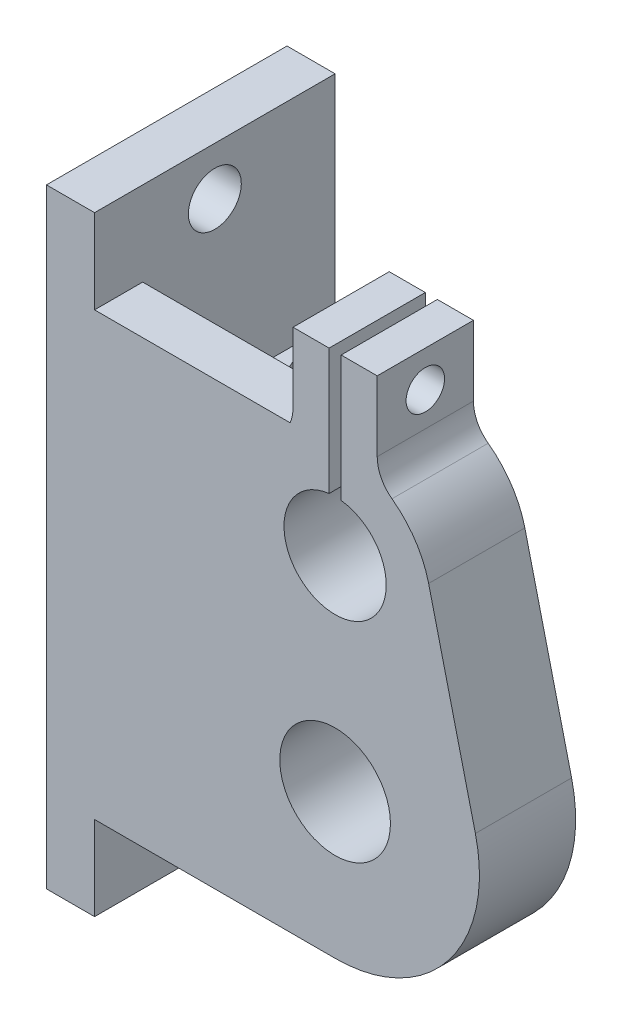
ISO-10303-21;
HEADER;
FILE_DESCRIPTION(('STEP AP214'),'2;1');
FILE_NAME('part.step','',(''),(''),'','','');
FILE_SCHEMA(('AUTOMOTIVE_DESIGN { 1 0 10303 214 1 1 1 1 }'));
ENDSEC;
DATA;
#1=APPLICATION_CONTEXT('core data for automotive mechanical design processes');
#2=APPLICATION_PROTOCOL_DEFINITION('international standard','automotive_design',2000,#1);
#3=PRODUCT_CONTEXT('',#1,'mechanical');
#4=PRODUCT('Part','Part','',(#3));
#5=PRODUCT_RELATED_PRODUCT_CATEGORY('part','',(#4));
#6=PRODUCT_DEFINITION_FORMATION('','',#4);
#7=PRODUCT_DEFINITION_CONTEXT('part definition',#1,'design');
#8=PRODUCT_DEFINITION('design','',#6,#7);
#9=PRODUCT_DEFINITION_SHAPE('','',#8);
#10=(LENGTH_UNIT() NAMED_UNIT(*) SI_UNIT(.MILLI.,.METRE.));
#11=(NAMED_UNIT(*) PLANE_ANGLE_UNIT() SI_UNIT($,.RADIAN.));
#12=(NAMED_UNIT(*) SI_UNIT($,.STERADIAN.) SOLID_ANGLE_UNIT());
#13=UNCERTAINTY_MEASURE_WITH_UNIT(LENGTH_MEASURE(1.E-05),#10,'distance_accuracy_value','');
#14=(GEOMETRIC_REPRESENTATION_CONTEXT(3) GLOBAL_UNCERTAINTY_ASSIGNED_CONTEXT((#13)) GLOBAL_UNIT_ASSIGNED_CONTEXT((#10,
#11,#12)) REPRESENTATION_CONTEXT('',''));
#15=CARTESIAN_POINT('',(0.,0.,0.));
#16=DIRECTION('',(0.,0.,1.));
#17=DIRECTION('',(1.,0.,0.));
#18=AXIS2_PLACEMENT_3D('',#15,#16,#17);
#19=CARTESIAN_POINT('',(27.5,0.,4.));
#20=DIRECTION('',(1.,0.,0.));
#21=DIRECTION('',(0.,1.,0.));
#22=AXIS2_PLACEMENT_3D('',#19,#20,#21);
#23=PLANE('',#22);
#24=DIRECTION('',(0.,0.,-1.));
#25=VECTOR('',#24,1.);
#26=CARTESIAN_POINT('',(27.5,46.8741196746494,4.));
#27=LINE('',#26,#25);
#28=CARTESIAN_POINT('',(27.5,46.8741196746494,4.));
#29=VERTEX_POINT('',#28);
#30=CARTESIAN_POINT('',(27.5,46.8741196746494,-4.));
#31=VERTEX_POINT('',#30);
#32=EDGE_CURVE('E477',#29,#31,#27,.T.);
#33=ORIENTED_EDGE('',*,*,#32,.T.);
#34=DIRECTION('',(0.,-1.,0.));
#35=VECTOR('',#34,1.);
#36=CARTESIAN_POINT('',(27.5,0.,-4.));
#37=LINE('',#36,#35);
#38=CARTESIAN_POINT('',(27.5,52.6937472849691,-4.));
#39=VERTEX_POINT('',#38);
#40=EDGE_CURVE('E307',#39,#31,#37,.T.);
#41=ORIENTED_EDGE('',*,*,#40,.F.);
#42=DIRECTION('',(0.,0.,-1.));
#43=VECTOR('',#42,1.);
#44=CARTESIAN_POINT('',(27.5,52.6937472849691,4.));
#45=LINE('',#44,#43);
#46=CARTESIAN_POINT('',(27.5,52.6937472849691,4.));
#47=VERTEX_POINT('',#46);
#48=EDGE_CURVE('E475',#47,#39,#45,.T.);
#49=ORIENTED_EDGE('',*,*,#48,.F.);
#50=DIRECTION('',(0.,-1.,0.));
#51=VECTOR('',#50,1.);
#52=CARTESIAN_POINT('',(27.5,0.,4.));
#53=LINE('',#52,#51);
#54=EDGE_CURVE('E413',#47,#29,#53,.T.);
#55=ORIENTED_EDGE('',*,*,#54,.T.);
#56=EDGE_LOOP('',(#33,#41,#49,#55));
#57=FACE_BOUND('',#56,.T.);
#58=CARTESIAN_POINT('',(27.5,49.6937472849691,0.));
#59=DIRECTION('',(1.,0.,0.));
#60=DIRECTION('',(0.,1.,0.));
#61=AXIS2_PLACEMENT_3D('',#58,#59,#60);
#62=CIRCLE('',#61,1.6);
#63=CARTESIAN_POINT('',(27.5,51.2937472849691,0.));
#64=VERTEX_POINT('',#63);
#65=EDGE_CURVE('E277',#64,#64,#62,.F.);
#66=ORIENTED_EDGE('',*,*,#65,.T.);
#67=EDGE_LOOP('',(#66));
#68=FACE_BOUND('',#67,.T.);
#69=ADVANCED_FACE('F39',(#57,#68),#23,.T.);
#70=CARTESIAN_POINT('',(24.5,0.,4.));
#71=DIRECTION('',(1.,0.,0.));
#72=DIRECTION('',(0.,0.,-1.));
#73=AXIS2_PLACEMENT_3D('',#70,#71,#72);
#74=PLANE('',#73);
#75=DIRECTION('',(0.,0.,-1.));
#76=VECTOR('',#75,1.);
#77=CARTESIAN_POINT('',(24.5,52.6937472849691,4.));
#78=LINE('',#77,#76);
#79=CARTESIAN_POINT('',(24.5,52.6937472849691,4.));
#80=VERTEX_POINT('',#79);
#81=CARTESIAN_POINT('',(24.5,52.6937472849691,-4.));
#82=VERTEX_POINT('',#81);
#83=EDGE_CURVE('E473',#80,#82,#78,.T.);
#84=ORIENTED_EDGE('',*,*,#83,.T.);
#85=DIRECTION('',(0.,-1.,0.));
#86=VECTOR('',#85,1.);
#87=CARTESIAN_POINT('',(24.5,0.,-4.));
#88=LINE('',#87,#86);
#89=CARTESIAN_POINT('',(24.5,42.2204857540335,-4.));
#90=VERTEX_POINT('',#89);
#91=EDGE_CURVE('E314',#82,#90,#88,.T.);
#92=ORIENTED_EDGE('',*,*,#91,.T.);
#93=DIRECTION('',(0.,0.,-1.));
#94=VECTOR('',#93,1.);
#95=CARTESIAN_POINT('',(24.5,42.2204857540335,4.));
#96=LINE('',#95,#94);
#97=CARTESIAN_POINT('',(24.5,42.2204857540335,4.));
#98=VERTEX_POINT('',#97);
#99=EDGE_CURVE('E471',#98,#90,#96,.T.);
#100=ORIENTED_EDGE('',*,*,#99,.F.);
#101=DIRECTION('',(0.,-1.,0.));
#102=VECTOR('',#101,1.);
#103=CARTESIAN_POINT('',(24.5,0.,4.));
#104=LINE('',#103,#102);
#105=EDGE_CURVE('E418',#80,#98,#104,.T.);
#106=ORIENTED_EDGE('',*,*,#105,.F.);
#107=EDGE_LOOP('',(#84,#92,#100,#106));
#108=FACE_BOUND('',#107,.T.);
#109=CARTESIAN_POINT('',(24.5,49.6937472849689,0.));
#110=DIRECTION('',(1.,0.,0.));
#111=DIRECTION('',(0.,0.,-1.));
#112=AXIS2_PLACEMENT_3D('',#109,#110,#111);
#113=CIRCLE('',#112,1.6);
#114=CARTESIAN_POINT('',(24.5,49.6937472849689,-1.6));
#115=VERTEX_POINT('',#114);
#116=EDGE_CURVE('E274',#115,#115,#113,.F.);
#117=ORIENTED_EDGE('',*,*,#116,.F.);
#118=EDGE_LOOP('',(#117));
#119=FACE_BOUND('',#118,.T.);
#120=ADVANCED_FACE('F533',(#108,#119),#74,.F.);
#121=CARTESIAN_POINT('',(23.5,0.,4.));
#122=DIRECTION('',(1.,0.,0.));
#123=DIRECTION('',(0.,0.,-1.));
#124=AXIS2_PLACEMENT_3D('',#121,#122,#123);
#125=PLANE('',#124);
#126=DIRECTION('',(0.,0.,-1.));
#127=VECTOR('',#126,1.);
#128=CARTESIAN_POINT('',(23.5,42.2204857540335,4.));
#129=LINE('',#128,#127);
#130=CARTESIAN_POINT('',(23.5,42.2204857540335,4.));
#131=VERTEX_POINT('',#130);
#132=CARTESIAN_POINT('',(23.5,42.2204857540335,-4.));
#133=VERTEX_POINT('',#132);
#134=EDGE_CURVE('E469',#131,#133,#129,.T.);
#135=ORIENTED_EDGE('',*,*,#134,.T.);
#136=DIRECTION('',(0.,-1.,0.));
#137=VECTOR('',#136,1.);
#138=CARTESIAN_POINT('',(23.5,0.,-4.));
#139=LINE('',#138,#137);
#140=CARTESIAN_POINT('',(23.5,52.6937472849691,-4.));
#141=VERTEX_POINT('',#140);
#142=EDGE_CURVE('E320',#141,#133,#139,.T.);
#143=ORIENTED_EDGE('',*,*,#142,.F.);
#144=DIRECTION('',(0.,0.,-1.));
#145=VECTOR('',#144,1.);
#146=CARTESIAN_POINT('',(23.5,52.6937472849691,4.));
#147=LINE('',#146,#145);
#148=CARTESIAN_POINT('',(23.5,52.6937472849691,4.));
#149=VERTEX_POINT('',#148);
#150=EDGE_CURVE('E467',#149,#141,#147,.T.);
#151=ORIENTED_EDGE('',*,*,#150,.F.);
#152=DIRECTION('',(0.,-1.,0.));
#153=VECTOR('',#152,1.);
#154=CARTESIAN_POINT('',(23.5,0.,4.));
#155=LINE('',#154,#153);
#156=EDGE_CURVE('E423',#149,#131,#155,.T.);
#157=ORIENTED_EDGE('',*,*,#156,.T.);
#158=EDGE_LOOP('',(#135,#143,#151,#157));
#159=FACE_BOUND('',#158,.T.);
#160=CARTESIAN_POINT('',(23.5,49.6937472849689,0.));
#161=DIRECTION('',(1.,0.,0.));
#162=DIRECTION('',(0.,0.,-1.));
#163=AXIS2_PLACEMENT_3D('',#160,#161,#162);
#164=CIRCLE('',#163,1.6);
#165=CARTESIAN_POINT('',(23.5,49.6937472849689,-1.6));
#166=VERTEX_POINT('',#165);
#167=EDGE_CURVE('E271',#166,#166,#164,.F.);
#168=ORIENTED_EDGE('',*,*,#167,.T.);
#169=EDGE_LOOP('',(#168));
#170=FACE_BOUND('',#169,.T.);
#171=ADVANCED_FACE('F519',(#159,#170),#125,.T.);
#172=CARTESIAN_POINT('',(20.5,0.,4.));
#173=DIRECTION('',(1.,0.,0.));
#174=DIRECTION('',(0.,1.,0.));
#175=AXIS2_PLACEMENT_3D('',#172,#173,#174);
#176=PLANE('',#175);
#177=DIRECTION('',(0.,0.,-1.));
#178=VECTOR('',#177,1.);
#179=CARTESIAN_POINT('',(20.5,52.6937472849691,4.));
#180=LINE('',#179,#178);
#181=CARTESIAN_POINT('',(20.5,52.6937472849691,4.));
#182=VERTEX_POINT('',#181);
#183=CARTESIAN_POINT('',(20.5,52.6937472849691,-4.));
#184=VERTEX_POINT('',#183);
#185=EDGE_CURVE('E465',#182,#184,#180,.T.);
#186=ORIENTED_EDGE('',*,*,#185,.T.);
#187=DIRECTION('',(0.,-1.,0.));
#188=VECTOR('',#187,1.);
#189=CARTESIAN_POINT('',(20.5,0.,-4.));
#190=LINE('',#189,#188);
#191=CARTESIAN_POINT('',(20.5,46.8741196746494,-4.));
#192=VERTEX_POINT('',#191);
#193=EDGE_CURVE('E326',#184,#192,#190,.T.);
#194=ORIENTED_EDGE('',*,*,#193,.T.);
#195=DIRECTION('',(0.,0.,-1.));
#196=VECTOR('',#195,1.);
#197=CARTESIAN_POINT('',(20.5,46.8741196746494,4.));
#198=LINE('',#197,#196);
#199=CARTESIAN_POINT('',(20.5,46.8741196746494,4.));
#200=VERTEX_POINT('',#199);
#201=EDGE_CURVE('E388',#200,#192,#198,.T.);
#202=ORIENTED_EDGE('',*,*,#201,.F.);
#203=DIRECTION('',(0.,-1.,0.));
#204=VECTOR('',#203,1.);
#205=CARTESIAN_POINT('',(20.5,0.,4.));
#206=LINE('',#205,#204);
#207=EDGE_CURVE('E429',#182,#200,#206,.T.);
#208=ORIENTED_EDGE('',*,*,#207,.F.);
#209=EDGE_LOOP('',(#186,#194,#202,#208));
#210=FACE_BOUND('',#209,.T.);
#211=CARTESIAN_POINT('',(20.5,49.6937472849687,0.));
#212=DIRECTION('',(1.,0.,0.));
#213=DIRECTION('',(0.,1.,0.));
#214=AXIS2_PLACEMENT_3D('',#211,#212,#213);
#215=CIRCLE('',#214,1.6);
#216=CARTESIAN_POINT('',(20.5,51.2937472849687,0.));
#217=VERTEX_POINT('',#216);
#218=EDGE_CURVE('E43',#217,#217,#215,.F.);
#219=ORIENTED_EDGE('',*,*,#218,.F.);
#220=EDGE_LOOP('',(#219));
#221=FACE_BOUND('',#220,.T.);
#222=ADVANCED_FACE('F509',(#210,#221),#176,.F.);
#223=CARTESIAN_POINT('',(0.,0.,4.));
#224=DIRECTION('',(1.,0.,0.));
#225=DIRECTION('',(0.,1.,0.));
#226=AXIS2_PLACEMENT_3D('',#223,#224,#225);
#227=PLANE('',#226);
#228=CARTESIAN_POINT('',(0.,5.99999999999979,-6.));
#229=DIRECTION('',(1.,0.,0.));
#230=DIRECTION('',(0.,1.,0.));
#231=AXIS2_PLACEMENT_3D('',#228,#229,#230);
#232=CIRCLE('',#231,2.2);
#233=CARTESIAN_POINT('',(0.,8.19999999999979,-6.));
#234=VERTEX_POINT('',#233);
#235=EDGE_CURVE('E283',#234,#234,#232,.T.);
#236=ORIENTED_EDGE('',*,*,#235,.T.);
#237=EDGE_LOOP('',(#236));
#238=FACE_BOUND('',#237,.T.);
#239=DIRECTION('',(0.,0.,-1.));
#240=VECTOR('',#239,1.);
#241=CARTESIAN_POINT('',(0.,2.,4.));
#242=LINE('',#241,#240);
#243=CARTESIAN_POINT('',(0.,2.,4.));
#244=VERTEX_POINT('',#243);
#245=CARTESIAN_POINT('',(0.,2.,-16.));
#246=VERTEX_POINT('',#245);
#247=EDGE_CURVE('E455',#244,#246,#242,.T.);
#248=ORIENTED_EDGE('',*,*,#247,.F.);
#249=DIRECTION('',(0.,-1.,0.));
#250=VECTOR('',#249,1.);
#251=CARTESIAN_POINT('',(0.,0.,4.));
#252=LINE('',#251,#250);
#253=CARTESIAN_POINT('',(0.,52.6937472849691,4.));
#254=VERTEX_POINT('',#253);
#255=EDGE_CURVE('E443',#254,#244,#252,.T.);
#256=ORIENTED_EDGE('',*,*,#255,.F.);
#257=DIRECTION('',(0.,0.,-1.));
#258=VECTOR('',#257,1.);
#259=CARTESIAN_POINT('',(0.,52.6937472849691,4.));
#260=LINE('',#259,#258);
#261=CARTESIAN_POINT('',(0.,52.6937472849691,-16.));
#262=VERTEX_POINT('',#261);
#263=EDGE_CURVE('E458',#254,#262,#260,.T.);
#264=ORIENTED_EDGE('',*,*,#263,.T.);
#265=DIRECTION('',(0.,-1.,0.));
#266=VECTOR('',#265,1.);
#267=CARTESIAN_POINT('',(0.,0.,-16.));
#268=LINE('',#267,#266);
#269=EDGE_CURVE('E301',#262,#246,#268,.T.);
#270=ORIENTED_EDGE('',*,*,#269,.T.);
#271=EDGE_LOOP('',(#248,#256,#264,#270));
#272=FACE_BOUND('',#271,.T.);
#273=CARTESIAN_POINT('',(0.,48.6937472849689,-5.99999999999999));
#274=DIRECTION('',(1.,0.,0.));
#275=DIRECTION('',(0.,1.,0.));
#276=AXIS2_PLACEMENT_3D('',#273,#274,#275);
#277=CIRCLE('',#276,2.2);
#278=CARTESIAN_POINT('',(0.,50.8937472849689,-5.99999999999999));
#279=VERTEX_POINT('',#278);
#280=EDGE_CURVE('E289',#279,#279,#277,.F.);
#281=ORIENTED_EDGE('',*,*,#280,.F.);
#282=EDGE_LOOP('',(#281));
#283=FACE_BOUND('',#282,.T.);
#284=ADVANCED_FACE('F575',(#238,#272,#283),#227,.F.);
#285=CARTESIAN_POINT('',(4.00000000000043,1.90048411225749E-13,4.));
#286=DIRECTION('',(1.,0.,0.));
#287=DIRECTION('',(0.,1.,0.));
#288=AXIS2_PLACEMENT_3D('',#285,#286,#287);
#289=PLANE('',#288);
#290=DIRECTION('',(0.,0.,-1.));
#291=VECTOR('',#290,1.);
#292=CARTESIAN_POINT('',(3.99999999999901,29.8468736424845,4.));
#293=LINE('',#292,#291);
#294=CARTESIAN_POINT('',(3.99999999999901,29.8468736424845,0.));
#295=VERTEX_POINT('',#294);
#296=CARTESIAN_POINT('',(3.99999999999901,29.8468736424845,-13.9999999999982));
#297=VERTEX_POINT('',#296);
#298=EDGE_CURVE('E234',#295,#297,#293,.T.);
#299=ORIENTED_EDGE('',*,*,#298,.F.);
#300=DIRECTION('',(0.,-1.,0.));
#301=VECTOR('',#300,1.);
#302=CARTESIAN_POINT('',(4.00000000000043,1.90048411225749E-13,0.));
#303=LINE('',#302,#301);
#304=CARTESIAN_POINT('',(3.99999999999941,21.5,0.));
#305=VERTEX_POINT('',#304);
#306=EDGE_CURVE('E48',#295,#305,#303,.T.);
#307=ORIENTED_EDGE('',*,*,#306,.T.);
#308=DIRECTION('',(0.,0.,-1.));
#309=VECTOR('',#308,1.);
#310=CARTESIAN_POINT('',(3.99999999999941,21.5,4.));
#311=LINE('',#310,#309);
#312=CARTESIAN_POINT('',(3.99999999999941,21.5,-13.9999999999973));
#313=VERTEX_POINT('',#312);
#314=EDGE_CURVE('E259',#305,#313,#311,.T.);
#315=ORIENTED_EDGE('',*,*,#314,.T.);
#316=DIRECTION('',(0.,1.,-1.10861573214976E-13));
#317=VECTOR('',#316,1.);
#318=CARTESIAN_POINT('',(4.00000000000043,-1.80545990664326E-12,-13.9999999999949));
#319=LINE('',#318,#317);
#320=CARTESIAN_POINT('',(3.99999999999964,16.5,-13.9999999999968));
#321=VERTEX_POINT('',#320);
#322=EDGE_CURVE('E268',#321,#313,#319,.T.);
#323=ORIENTED_EDGE('',*,*,#322,.F.);
#324=DIRECTION('',(0.,0.,-1.));
#325=VECTOR('',#324,1.);
#326=CARTESIAN_POINT('',(3.99999999999964,16.5,4.));
#327=LINE('',#326,#325);
#328=CARTESIAN_POINT('',(3.99999999999964,16.5,0.));
#329=VERTEX_POINT('',#328);
#330=EDGE_CURVE('E263',#329,#321,#327,.T.);
#331=ORIENTED_EDGE('',*,*,#330,.F.);
#332=CARTESIAN_POINT('',(4.,9.00000000000001,0.));
#333=VERTEX_POINT('',#332);
#334=EDGE_CURVE('E49',#329,#333,#303,.T.);
#335=ORIENTED_EDGE('',*,*,#334,.T.);
#336=DIRECTION('',(0.,0.,-1.));
#337=VECTOR('',#336,1.);
#338=CARTESIAN_POINT('',(4.,9.00000000000001,4.));
#339=LINE('',#338,#337);
#340=CARTESIAN_POINT('',(4.,9.00000000000001,4.));
#341=VERTEX_POINT('',#340);
#342=EDGE_CURVE('E450',#341,#333,#339,.T.);
#343=ORIENTED_EDGE('',*,*,#342,.F.);
#344=DIRECTION('',(0.,-1.,0.));
#345=VECTOR('',#344,1.);
#346=CARTESIAN_POINT('',(4.00000000000043,1.90048411225749E-13,4.));
#347=LINE('',#346,#345);
#348=CARTESIAN_POINT('',(4.,2.,4.));
#349=VERTEX_POINT('',#348);
#350=EDGE_CURVE('E440',#341,#349,#347,.T.);
#351=ORIENTED_EDGE('',*,*,#350,.T.);
#352=DIRECTION('',(0.,0.,-1.));
#353=VECTOR('',#352,1.);
#354=CARTESIAN_POINT('',(4.,2.,4.));
#355=LINE('',#354,#353);
#356=CARTESIAN_POINT('',(4.00000000000033,2.,-16.));
#357=VERTEX_POINT('',#356);
#358=EDGE_CURVE('E453',#349,#357,#355,.T.);
#359=ORIENTED_EDGE('',*,*,#358,.T.);
#360=DIRECTION('',(0.,-1.,0.));
#361=VECTOR('',#360,1.);
#362=CARTESIAN_POINT('',(4.00000000000043,1.90048411225749E-13,-16.));
#363=LINE('',#362,#361);
#364=CARTESIAN_POINT('',(3.99999999999792,52.6937472849691,-16.));
#365=VERTEX_POINT('',#364);
#366=EDGE_CURVE('E295',#365,#357,#363,.T.);
#367=ORIENTED_EDGE('',*,*,#366,.F.);
#368=DIRECTION('',(0.,0.,-1.));
#369=VECTOR('',#368,1.);
#370=CARTESIAN_POINT('',(3.99999999999826,52.6937472849691,4.));
#371=LINE('',#370,#369);
#372=CARTESIAN_POINT('',(3.99999999999826,52.6937472849691,4.));
#373=VERTEX_POINT('',#372);
#374=EDGE_CURVE('E460',#373,#365,#371,.T.);
#375=ORIENTED_EDGE('',*,*,#374,.F.);
#376=CARTESIAN_POINT('',(3.99999999999826,45.6937472849691,4.));
#377=VERTEX_POINT('',#376);
#378=EDGE_CURVE('E436',#373,#377,#347,.T.);
#379=ORIENTED_EDGE('',*,*,#378,.T.);
#380=DIRECTION('',(0.,0.,-1.));
#381=VECTOR('',#380,1.);
#382=CARTESIAN_POINT('',(3.99999999999826,45.6937472849691,4.));
#383=LINE('',#382,#381);
#384=CARTESIAN_POINT('',(3.99999999999826,45.6937472849691,0.));
#385=VERTEX_POINT('',#384);
#386=EDGE_CURVE('E389',#377,#385,#383,.T.);
#387=ORIENTED_EDGE('',*,*,#386,.T.);
#388=CARTESIAN_POINT('',(3.99999999999877,34.8468736424845,0.));
#389=VERTEX_POINT('',#388);
#390=EDGE_CURVE('E11',#385,#389,#303,.T.);
#391=ORIENTED_EDGE('',*,*,#390,.T.);
#392=DIRECTION('',(0.,0.,-1.));
#393=VECTOR('',#392,1.);
#394=CARTESIAN_POINT('',(3.99999999999877,34.8468736424845,4.));
#395=LINE('',#394,#393);
#396=CARTESIAN_POINT('',(3.99999999999877,34.8468736424845,-13.9999999999988));
#397=VERTEX_POINT('',#396);
#398=EDGE_CURVE('E60',#389,#397,#395,.T.);
#399=ORIENTED_EDGE('',*,*,#398,.T.);
#400=DIRECTION('',(0.,1.,-1.10861573214976E-13));
#401=VECTOR('',#400,1.);
#402=CARTESIAN_POINT('',(4.00000000000043,-1.80545990664326E-12,-13.9999999999949));
#403=LINE('',#402,#401);
#404=EDGE_CURVE('E56',#297,#397,#403,.T.);
#405=ORIENTED_EDGE('',*,*,#404,.F.);
#406=EDGE_LOOP('',(#299,#307,#315,#323,#331,#335,#343,#351,#359,#367,#375,#379,#387,#391,#399,#405));
#407=FACE_BOUND('',#406,.T.);
#408=CARTESIAN_POINT('',(3.99999999999795,48.6937472849691,-5.99999999999999));
#409=DIRECTION('',(1.,0.,0.));
#410=DIRECTION('',(0.,1.,0.));
#411=AXIS2_PLACEMENT_3D('',#408,#409,#410);
#412=CIRCLE('',#411,2.2);
#413=CARTESIAN_POINT('',(3.99999999999783,50.8937472849691,-5.99999999999999));
#414=VERTEX_POINT('',#413);
#415=EDGE_CURVE('E286',#414,#414,#412,.F.);
#416=ORIENTED_EDGE('',*,*,#415,.T.);
#417=EDGE_LOOP('',(#416));
#418=FACE_BOUND('',#417,.T.);
#419=CARTESIAN_POINT('',(4.00000000000012,5.99999999999999,-6.));
#420=DIRECTION('',(1.,0.,0.));
#421=DIRECTION('',(0.,1.,0.));
#422=AXIS2_PLACEMENT_3D('',#419,#420,#421);
#423=CIRCLE('',#422,2.2);
#424=CARTESIAN_POINT('',(4.00000000000001,8.19999999999999,-6.));
#425=VERTEX_POINT('',#424);
#426=EDGE_CURVE('E280',#425,#425,#423,.T.);
#427=ORIENTED_EDGE('',*,*,#426,.F.);
#428=EDGE_LOOP('',(#427));
#429=FACE_BOUND('',#428,.T.);
#430=ADVANCED_FACE('F589',(#407,#418,#429),#289,.T.);
#431=CARTESIAN_POINT('',(0.,0.,0.));
#432=DIRECTION('',(0.,0.,1.));
#433=DIRECTION('',(1.,0.,0.));
#434=AXIS2_PLACEMENT_3D('',#431,#432,#433);
#435=PLANE('',#434);
#436=ORIENTED_EDGE('',*,*,#306,.F.);
#437=DIRECTION('',(1.,0.,0.));
#438=VECTOR('',#437,1.);
#439=CARTESIAN_POINT('',(0.,29.8468736424845,0.));
#440=LINE('',#439,#438);
#441=CARTESIAN_POINT('',(10.,29.8468736424845,0.));
#442=VERTEX_POINT('',#441);
#443=EDGE_CURVE('E229',#295,#442,#440,.T.);
#444=ORIENTED_EDGE('',*,*,#443,.T.);
#445=DIRECTION('',(0.,1.,0.));
#446=VECTOR('',#445,1.);
#447=CARTESIAN_POINT('',(10.,0.,0.));
#448=LINE('',#447,#446);
#449=CARTESIAN_POINT('',(10.,34.8468736424845,0.));
#450=VERTEX_POINT('',#449);
#451=EDGE_CURVE('E223',#442,#450,#448,.T.);
#452=ORIENTED_EDGE('',*,*,#451,.T.);
#453=DIRECTION('',(1.,0.,0.));
#454=VECTOR('',#453,1.);
#455=CARTESIAN_POINT('',(0.,34.8468736424845,0.));
#456=LINE('',#455,#454);
#457=EDGE_CURVE('E227',#389,#450,#456,.T.);
#458=ORIENTED_EDGE('',*,*,#457,.F.);
#459=ORIENTED_EDGE('',*,*,#390,.F.);
#460=DIRECTION('',(1.,0.,0.));
#461=VECTOR('',#460,1.);
#462=CARTESIAN_POINT('',(0.,45.6937472849691,0.));
#463=LINE('',#462,#461);
#464=CARTESIAN_POINT('',(20.2580284664376,45.6937472849691,0.));
#465=VERTEX_POINT('',#464);
#466=EDGE_CURVE('E380',#385,#465,#463,.T.);
#467=ORIENTED_EDGE('',*,*,#466,.T.);
#468=CARTESIAN_POINT('',(17.5,46.8741196746494,0.));
#469=DIRECTION('',(0.,0.,1.));
#470=DIRECTION('',(1.,0.,0.));
#471=AXIS2_PLACEMENT_3D('',#468,#469,#470);
#472=CIRCLE('',#471,3.);
#473=CARTESIAN_POINT('',(19.2727272727273,44.4539052179268,0.));
#474=VERTEX_POINT('',#473);
#475=EDGE_CURVE('E374',#465,#474,#472,.F.);
#476=ORIENTED_EDGE('',*,*,#475,.T.);
#477=CARTESIAN_POINT('',(24.,38.,0.));
#478=DIRECTION('',(0.,0.,1.));
#479=DIRECTION('',(1.,0.,0.));
#480=AXIS2_PLACEMENT_3D('',#477,#478,#479);
#481=CIRCLE('',#480,8.);
#482=CARTESIAN_POINT('',(16.2246062861844,39.8823529411765,0.));
#483=VERTEX_POINT('',#482);
#484=EDGE_CURVE('E303',#474,#483,#481,.T.);
#485=ORIENTED_EDGE('',*,*,#484,.T.);
#486=DIRECTION('',(-0.23529411764706,-0.971924214226959,0.));
#487=VECTOR('',#486,1.);
#488=CARTESIAN_POINT('',(6.20574064755985,-1.50235404020207,0.));
#489=LINE('',#488,#487);
#490=CARTESIAN_POINT('',(12.3369094292765,23.8235294117647,0.));
#491=VERTEX_POINT('',#490);
#492=EDGE_CURVE('E353',#483,#491,#489,.T.);
#493=ORIENTED_EDGE('',*,*,#492,.T.);
#494=CARTESIAN_POINT('',(24.,21.,0.));
#495=DIRECTION('',(0.,0.,1.));
#496=DIRECTION('',(1.,0.,0.));
#497=AXIS2_PLACEMENT_3D('',#494,#495,#496);
#498=CIRCLE('',#497,12.);
#499=CARTESIAN_POINT('',(24.,9.00000000000001,0.));
#500=VERTEX_POINT('',#499);
#501=EDGE_CURVE('E308',#491,#500,#498,.T.);
#502=ORIENTED_EDGE('',*,*,#501,.T.);
#503=DIRECTION('',(1.,0.,0.));
#504=VECTOR('',#503,1.);
#505=CARTESIAN_POINT('',(0.,9.00000000000001,0.));
#506=LINE('',#505,#504);
#507=EDGE_CURVE('E358',#333,#500,#506,.T.);
#508=ORIENTED_EDGE('',*,*,#507,.F.);
#509=ORIENTED_EDGE('',*,*,#334,.F.);
#510=DIRECTION('',(1.,0.,0.));
#511=VECTOR('',#510,1.);
#512=CARTESIAN_POINT('',(0.,16.5,0.));
#513=LINE('',#512,#511);
#514=CARTESIAN_POINT('',(10.,16.5,0.));
#515=VERTEX_POINT('',#514);
#516=EDGE_CURVE('E261',#329,#515,#513,.T.);
#517=ORIENTED_EDGE('',*,*,#516,.T.);
#518=DIRECTION('',(0.,1.,0.));
#519=VECTOR('',#518,1.);
#520=CARTESIAN_POINT('',(10.,0.,0.));
#521=LINE('',#520,#519);
#522=CARTESIAN_POINT('',(10.,21.5,0.));
#523=VERTEX_POINT('',#522);
#524=EDGE_CURVE('E266',#515,#523,#521,.T.);
#525=ORIENTED_EDGE('',*,*,#524,.T.);
#526=DIRECTION('',(1.,0.,0.));
#527=VECTOR('',#526,1.);
#528=CARTESIAN_POINT('',(0.,21.5,0.));
#529=LINE('',#528,#527);
#530=EDGE_CURVE('E254',#305,#523,#529,.T.);
#531=ORIENTED_EDGE('',*,*,#530,.F.);
#532=EDGE_LOOP('',(#436,#444,#452,#458,#459,#467,#476,#485,#493,#502,#508,#509,#517,#525,#531));
#533=FACE_BOUND('',#532,.T.);
#534=ADVANCED_FACE('F226',(#533),#435,.F.);
#535=CARTESIAN_POINT('',(0.,9.00000000000001,4.));
#536=DIRECTION('',(0.,1.,0.));
#537=DIRECTION('',(0.,0.,1.));
#538=AXIS2_PLACEMENT_3D('',#535,#536,#537);
#539=PLANE('',#538);
#540=ORIENTED_EDGE('',*,*,#507,.T.);
#541=DIRECTION('',(0.,0.,-1.));
#542=VECTOR('',#541,1.);
#543=CARTESIAN_POINT('',(24.,9.00000000000001,4.));
#544=LINE('',#543,#542);
#545=CARTESIAN_POINT('',(24.,9.00000000000001,4.));
#546=VERTEX_POINT('',#545);
#547=EDGE_CURVE('E371',#546,#500,#544,.T.);
#548=ORIENTED_EDGE('',*,*,#547,.F.);
#549=DIRECTION('',(1.,0.,0.));
#550=VECTOR('',#549,1.);
#551=CARTESIAN_POINT('',(0.,9.00000000000001,4.));
#552=LINE('',#551,#550);
#553=EDGE_CURVE('E364',#341,#546,#552,.T.);
#554=ORIENTED_EDGE('',*,*,#553,.F.);
#555=ORIENTED_EDGE('',*,*,#342,.T.);
#556=EDGE_LOOP('',(#540,#548,#554,#555));
#557=FACE_BOUND('',#556,.T.);
#558=ADVANCED_FACE('F41',(#557),#539,.F.);
#559=CARTESIAN_POINT('',(24.,21.,4.));
#560=DIRECTION('',(0.,0.,-1.));
#561=DIRECTION('',(-1.,0.,0.));
#562=AXIS2_PLACEMENT_3D('',#559,#560,#561);
#563=CYLINDRICAL_SURFACE('',#562,12.);
#564=ORIENTED_EDGE('',*,*,#547,.T.);
#565=ORIENTED_EDGE('',*,*,#501,.F.);
#566=DIRECTION('',(0.,0.,1.));
#567=VECTOR('',#566,1.);
#568=CARTESIAN_POINT('',(12.3369094292765,23.8235294117647,-4.));
#569=LINE('',#568,#567);
#570=CARTESIAN_POINT('',(12.3369094292765,23.8235294117647,-4.));
#571=VERTEX_POINT('',#570);
#572=EDGE_CURVE('E356',#571,#491,#569,.T.);
#573=ORIENTED_EDGE('',*,*,#572,.F.);
#574=CARTESIAN_POINT('',(24.,21.,-4.));
#575=DIRECTION('',(0.,0.,1.));
#576=DIRECTION('',(1.,0.,0.));
#577=AXIS2_PLACEMENT_3D('',#574,#575,#576);
#578=CIRCLE('',#577,12.);
#579=CARTESIAN_POINT('',(35.6630905707235,23.8235294117647,-4.));
#580=VERTEX_POINT('',#579);
#581=EDGE_CURVE('E338',#571,#580,#578,.T.);
#582=ORIENTED_EDGE('',*,*,#581,.T.);
#583=DIRECTION('',(0.,0.,-1.));
#584=VECTOR('',#583,1.);
#585=CARTESIAN_POINT('',(35.6630905707235,23.8235294117647,4.));
#586=LINE('',#585,#584);
#587=CARTESIAN_POINT('',(35.6630905707235,23.8235294117647,4.));
#588=VERTEX_POINT('',#587);
#589=EDGE_CURVE('E375',#588,#580,#586,.T.);
#590=ORIENTED_EDGE('',*,*,#589,.F.);
#591=CARTESIAN_POINT('',(24.,21.,4.));
#592=DIRECTION('',(0.,0.,1.));
#593=DIRECTION('',(1.,0.,0.));
#594=AXIS2_PLACEMENT_3D('',#591,#592,#593);
#595=CIRCLE('',#594,12.);
#596=EDGE_CURVE('E397',#546,#588,#595,.T.);
#597=ORIENTED_EDGE('',*,*,#596,.F.);
#598=EDGE_LOOP('',(#564,#565,#573,#582,#590,#597));
#599=FACE_BOUND('',#598,.T.);
#600=ADVANCED_FACE('F492',(#599),#563,.T.);
#601=CARTESIAN_POINT('',(39.1368199060733,9.47467237930237,4.));
#602=DIRECTION('',(0.97192421422696,0.235294117647058,0.));
#603=DIRECTION('',(-0.235294117647058,0.97192421422696,0.));
#604=AXIS2_PLACEMENT_3D('',#601,#602,#603);
#605=PLANE('',#604);
#606=ORIENTED_EDGE('',*,*,#589,.T.);
#607=DIRECTION('',(0.235294117647058,-0.97192421422696,0.));
#608=VECTOR('',#607,1.);
#609=CARTESIAN_POINT('',(39.1368199060733,9.47467237930237,-4.));
#610=LINE('',#609,#608);
#611=CARTESIAN_POINT('',(31.7753937138157,39.8823529411765,-4.));
#612=VERTEX_POINT('',#611);
#613=EDGE_CURVE('E341',#612,#580,#610,.T.);
#614=ORIENTED_EDGE('',*,*,#613,.F.);
#615=DIRECTION('',(0.,0.,-1.));
#616=VECTOR('',#615,1.);
#617=CARTESIAN_POINT('',(31.7753937138157,39.8823529411765,4.));
#618=LINE('',#617,#616);
#619=CARTESIAN_POINT('',(31.7753937138157,39.8823529411765,4.));
#620=VERTEX_POINT('',#619);
#621=EDGE_CURVE('E481',#620,#612,#618,.T.);
#622=ORIENTED_EDGE('',*,*,#621,.F.);
#623=DIRECTION('',(0.235294117647058,-0.97192421422696,0.));
#624=VECTOR('',#623,1.);
#625=CARTESIAN_POINT('',(39.1368199060733,9.47467237930237,4.));
#626=LINE('',#625,#624);
#627=EDGE_CURVE('E402',#620,#588,#626,.T.);
#628=ORIENTED_EDGE('',*,*,#627,.T.);
#629=EDGE_LOOP('',(#606,#614,#622,#628));
#630=FACE_BOUND('',#629,.T.);
#631=ADVANCED_FACE('F484',(#630),#605,.T.);
#632=CARTESIAN_POINT('',(24.,38.,4.));
#633=DIRECTION('',(0.,0.,-1.));
#634=DIRECTION('',(-1.,0.,0.));
#635=AXIS2_PLACEMENT_3D('',#632,#633,#634);
#636=CYLINDRICAL_SURFACE('',#635,7.99999999999999);
#637=ORIENTED_EDGE('',*,*,#621,.T.);
#638=CARTESIAN_POINT('',(24.,38.,-4.));
#639=DIRECTION('',(0.,0.,1.));
#640=DIRECTION('',(1.,0.,0.));
#641=AXIS2_PLACEMENT_3D('',#638,#639,#640);
#642=CIRCLE('',#641,7.99999999999999);
#643=CARTESIAN_POINT('',(28.7272727272727,44.4539052179269,-4.));
#644=VERTEX_POINT('',#643);
#645=EDGE_CURVE('E344',#612,#644,#642,.T.);
#646=ORIENTED_EDGE('',*,*,#645,.T.);
#647=DIRECTION('',(0.,0.,-1.));
#648=VECTOR('',#647,1.);
#649=CARTESIAN_POINT('',(28.7272727272727,44.4539052179269,4.));
#650=LINE('',#649,#648);
#651=CARTESIAN_POINT('',(28.7272727272727,44.4539052179269,4.));
#652=VERTEX_POINT('',#651);
#653=EDGE_CURVE('E479',#652,#644,#650,.T.);
#654=ORIENTED_EDGE('',*,*,#653,.F.);
#655=CARTESIAN_POINT('',(24.,38.,4.));
#656=DIRECTION('',(0.,0.,1.));
#657=DIRECTION('',(1.,0.,0.));
#658=AXIS2_PLACEMENT_3D('',#655,#656,#657);
#659=CIRCLE('',#658,7.99999999999999);
#660=EDGE_CURVE('E406',#620,#652,#659,.T.);
#661=ORIENTED_EDGE('',*,*,#660,.F.);
#662=EDGE_LOOP('',(#637,#646,#654,#661));
#663=FACE_BOUND('',#662,.T.);
#664=ADVANCED_FACE('F549',(#663),#636,.T.);
#665=CARTESIAN_POINT('',(30.5,46.8741196746494,4.));
#666=DIRECTION('',(0.,0.,-1.));
#667=DIRECTION('',(-1.,0.,0.));
#668=AXIS2_PLACEMENT_3D('',#665,#666,#667);
#669=CYLINDRICAL_SURFACE('',#668,3.);
#670=ORIENTED_EDGE('',*,*,#653,.T.);
#671=CARTESIAN_POINT('',(30.5,46.8741196746494,-4.));
#672=DIRECTION('',(0.,0.,1.));
#673=DIRECTION('',(1.,0.,0.));
#674=AXIS2_PLACEMENT_3D('',#671,#672,#673);
#675=CIRCLE('',#674,3.);
#676=EDGE_CURVE('E304',#31,#644,#675,.T.);
#677=ORIENTED_EDGE('',*,*,#676,.F.);
#678=ORIENTED_EDGE('',*,*,#32,.F.);
#679=CARTESIAN_POINT('',(30.5,46.8741196746494,4.));
#680=DIRECTION('',(0.,0.,1.));
#681=DIRECTION('',(1.,0.,0.));
#682=AXIS2_PLACEMENT_3D('',#679,#680,#681);
#683=CIRCLE('',#682,3.);
#684=EDGE_CURVE('E410',#29,#652,#683,.T.);
#685=ORIENTED_EDGE('',*,*,#684,.T.);
#686=EDGE_LOOP('',(#670,#677,#678,#685));
#687=FACE_BOUND('',#686,.T.);
#688=ADVANCED_FACE('F544',(#687),#669,.F.);
#689=CARTESIAN_POINT('',(0.,52.6937472849691,4.));
#690=DIRECTION('',(0.,-1.,0.));
#691=DIRECTION('',(0.,0.,-1.));
#692=AXIS2_PLACEMENT_3D('',#689,#690,#691);
#693=PLANE('',#692);
#694=ORIENTED_EDGE('',*,*,#48,.T.);
#695=DIRECTION('',(-1.,0.,0.));
#696=VECTOR('',#695,1.);
#697=CARTESIAN_POINT('',(0.,52.6937472849691,-4.));
#698=LINE('',#697,#696);
#699=EDGE_CURVE('E311',#39,#82,#698,.T.);
#700=ORIENTED_EDGE('',*,*,#699,.T.);
#701=ORIENTED_EDGE('',*,*,#83,.F.);
#702=DIRECTION('',(-1.,0.,0.));
#703=VECTOR('',#702,1.);
#704=CARTESIAN_POINT('',(0.,52.6937472849691,4.));
#705=LINE('',#704,#703);
#706=EDGE_CURVE('E416',#47,#80,#705,.T.);
#707=ORIENTED_EDGE('',*,*,#706,.F.);
#708=EDGE_LOOP('',(#694,#700,#701,#707));
#709=FACE_BOUND('',#708,.T.);
#710=ADVANCED_FACE('F538',(#709),#693,.F.);
#711=CARTESIAN_POINT('',(24.,38.,4.));
#712=DIRECTION('',(0.,0.,-1.));
#713=DIRECTION('',(-1.,0.,0.));
#714=AXIS2_PLACEMENT_3D('',#711,#712,#713);
#715=CYLINDRICAL_SURFACE('',#714,4.25);
#716=ORIENTED_EDGE('',*,*,#99,.T.);
#717=CARTESIAN_POINT('',(24.,38.,-4.));
#718=DIRECTION('',(0.,0.,1.));
#719=DIRECTION('',(1.,0.,0.));
#720=AXIS2_PLACEMENT_3D('',#717,#718,#719);
#721=CIRCLE('',#720,4.25);
#722=EDGE_CURVE('E317',#133,#90,#721,.T.);
#723=ORIENTED_EDGE('',*,*,#722,.F.);
#724=ORIENTED_EDGE('',*,*,#134,.F.);
#725=CARTESIAN_POINT('',(24.,38.,4.));
#726=DIRECTION('',(0.,0.,1.));
#727=DIRECTION('',(1.,0.,0.));
#728=AXIS2_PLACEMENT_3D('',#725,#726,#727);
#729=CIRCLE('',#728,4.25);
#730=EDGE_CURVE('E420',#131,#98,#729,.T.);
#731=ORIENTED_EDGE('',*,*,#730,.T.);
#732=EDGE_LOOP('',(#716,#723,#724,#731));
#733=FACE_BOUND('',#732,.T.);
#734=ADVANCED_FACE('F524',(#733),#715,.F.);
#735=CARTESIAN_POINT('',(0.,52.6937472849691,4.));
#736=DIRECTION('',(0.,1.,0.));
#737=DIRECTION('',(0.,0.,1.));
#738=AXIS2_PLACEMENT_3D('',#735,#736,#737);
#739=PLANE('',#738);
#740=ORIENTED_EDGE('',*,*,#150,.T.);
#741=DIRECTION('',(1.,0.,0.));
#742=VECTOR('',#741,1.);
#743=CARTESIAN_POINT('',(0.,52.6937472849691,-4.));
#744=LINE('',#743,#742);
#745=EDGE_CURVE('E323',#184,#141,#744,.T.);
#746=ORIENTED_EDGE('',*,*,#745,.F.);
#747=ORIENTED_EDGE('',*,*,#185,.F.);
#748=DIRECTION('',(1.,0.,0.));
#749=VECTOR('',#748,1.);
#750=CARTESIAN_POINT('',(0.,52.6937472849691,4.));
#751=LINE('',#750,#749);
#752=EDGE_CURVE('E426',#182,#149,#751,.T.);
#753=ORIENTED_EDGE('',*,*,#752,.T.);
#754=EDGE_LOOP('',(#740,#746,#747,#753));
#755=FACE_BOUND('',#754,.T.);
#756=ADVANCED_FACE('F515',(#755),#739,.T.);
#757=CARTESIAN_POINT('',(17.5,46.8741196746494,4.));
#758=DIRECTION('',(0.,0.,-1.));
#759=DIRECTION('',(-1.,0.,0.));
#760=AXIS2_PLACEMENT_3D('',#757,#758,#759);
#761=CYLINDRICAL_SURFACE('',#760,3.);
#762=ORIENTED_EDGE('',*,*,#201,.T.);
#763=CARTESIAN_POINT('',(17.5,46.8741196746494,-4.));
#764=DIRECTION('',(0.,0.,1.));
#765=DIRECTION('',(1.,0.,0.));
#766=AXIS2_PLACEMENT_3D('',#763,#764,#765);
#767=CIRCLE('',#766,3.);
#768=CARTESIAN_POINT('',(19.2727272727273,44.4539052179268,-4.));
#769=VERTEX_POINT('',#768);
#770=EDGE_CURVE('E329',#192,#769,#767,.F.);
#771=ORIENTED_EDGE('',*,*,#770,.T.);
#772=DIRECTION('',(0.,0.,1.));
#773=VECTOR('',#772,1.);
#774=CARTESIAN_POINT('',(19.2727272727273,44.4539052179268,-4.));
#775=LINE('',#774,#773);
#776=EDGE_CURVE('E350',#769,#474,#775,.T.);
#777=ORIENTED_EDGE('',*,*,#776,.T.);
#778=ORIENTED_EDGE('',*,*,#475,.F.);
#779=DIRECTION('',(0.,0.,-1.));
#780=VECTOR('',#779,1.);
#781=CARTESIAN_POINT('',(20.2580284664376,45.6937472849691,4.));
#782=LINE('',#781,#780);
#783=CARTESIAN_POINT('',(20.2580284664376,45.6937472849691,4.));
#784=VERTEX_POINT('',#783);
#785=EDGE_CURVE('E385',#784,#465,#782,.T.);
#786=ORIENTED_EDGE('',*,*,#785,.F.);
#787=CARTESIAN_POINT('',(17.5,46.8741196746494,4.));
#788=DIRECTION('',(0.,0.,1.));
#789=DIRECTION('',(1.,0.,0.));
#790=AXIS2_PLACEMENT_3D('',#787,#788,#789);
#791=CIRCLE('',#790,3.);
#792=EDGE_CURVE('E431',#200,#784,#791,.F.);
#793=ORIENTED_EDGE('',*,*,#792,.F.);
#794=EDGE_LOOP('',(#762,#771,#777,#778,#786,#793));
#795=FACE_BOUND('',#794,.T.);
#796=ADVANCED_FACE('F503',(#795),#761,.F.);
#797=CARTESIAN_POINT('',(0.,45.6937472849691,4.));
#798=DIRECTION('',(0.,1.,0.));
#799=DIRECTION('',(0.,0.,1.));
#800=AXIS2_PLACEMENT_3D('',#797,#798,#799);
#801=PLANE('',#800);
#802=ORIENTED_EDGE('',*,*,#466,.F.);
#803=ORIENTED_EDGE('',*,*,#386,.F.);
#804=DIRECTION('',(1.,0.,0.));
#805=VECTOR('',#804,1.);
#806=CARTESIAN_POINT('',(0.,45.6937472849691,4.));
#807=LINE('',#806,#805);
#808=EDGE_CURVE('E433',#377,#784,#807,.T.);
#809=ORIENTED_EDGE('',*,*,#808,.T.);
#810=ORIENTED_EDGE('',*,*,#785,.T.);
#811=EDGE_LOOP('',(#802,#803,#809,#810));
#812=FACE_BOUND('',#811,.T.);
#813=ADVANCED_FACE('F578',(#812),#801,.T.);
#814=CARTESIAN_POINT('',(0.,52.6937472849691,4.));
#815=DIRECTION('',(0.,1.,0.));
#816=DIRECTION('',(0.,0.,1.));
#817=AXIS2_PLACEMENT_3D('',#814,#815,#816);
#818=PLANE('',#817);
#819=ORIENTED_EDGE('',*,*,#374,.T.);
#820=DIRECTION('',(1.,0.,0.));
#821=VECTOR('',#820,1.);
#822=CARTESIAN_POINT('',(0.,52.6937472849691,-16.));
#823=LINE('',#822,#821);
#824=EDGE_CURVE('E298',#262,#365,#823,.T.);
#825=ORIENTED_EDGE('',*,*,#824,.F.);
#826=ORIENTED_EDGE('',*,*,#263,.F.);
#827=DIRECTION('',(1.,0.,0.));
#828=VECTOR('',#827,1.);
#829=CARTESIAN_POINT('',(0.,52.6937472849691,4.));
#830=LINE('',#829,#828);
#831=EDGE_CURVE('E439',#254,#373,#830,.T.);
#832=ORIENTED_EDGE('',*,*,#831,.T.);
#833=EDGE_LOOP('',(#819,#825,#826,#832));
#834=FACE_BOUND('',#833,.T.);
#835=ADVANCED_FACE('F581',(#834),#818,.T.);
#836=CARTESIAN_POINT('',(0.,2.,4.));
#837=DIRECTION('',(0.,1.,0.));
#838=DIRECTION('',(-1.,0.,0.));
#839=AXIS2_PLACEMENT_3D('',#836,#837,#838);
#840=PLANE('',#839);
#841=ORIENTED_EDGE('',*,*,#247,.T.);
#842=DIRECTION('',(1.,0.,0.));
#843=VECTOR('',#842,1.);
#844=CARTESIAN_POINT('',(0.,2.,-16.));
#845=LINE('',#844,#843);
#846=EDGE_CURVE('E292',#246,#357,#845,.T.);
#847=ORIENTED_EDGE('',*,*,#846,.T.);
#848=ORIENTED_EDGE('',*,*,#358,.F.);
#849=DIRECTION('',(1.,0.,0.));
#850=VECTOR('',#849,1.);
#851=CARTESIAN_POINT('',(0.,2.,4.));
#852=LINE('',#851,#850);
#853=EDGE_CURVE('E445',#244,#349,#852,.T.);
#854=ORIENTED_EDGE('',*,*,#853,.F.);
#855=EDGE_LOOP('',(#841,#847,#848,#854));
#856=FACE_BOUND('',#855,.T.);
#857=ADVANCED_FACE('F585',(#856),#840,.F.);
#858=CARTESIAN_POINT('',(24.,21.,4.));
#859=DIRECTION('',(0.,0.,-1.));
#860=DIRECTION('',(-1.,0.,0.));
#861=AXIS2_PLACEMENT_3D('',#858,#859,#860);
#862=CYLINDRICAL_SURFACE('',#861,4.6);
#863=CARTESIAN_POINT('',(24.,21.,4.));
#864=DIRECTION('',(0.,0.,1.));
#865=DIRECTION('',(1.,0.,0.));
#866=AXIS2_PLACEMENT_3D('',#863,#864,#865);
#867=CIRCLE('',#866,4.6);
#868=CARTESIAN_POINT('',(28.6,21.,4.));
#869=VERTEX_POINT('',#868);
#870=EDGE_CURVE('E447',#869,#869,#867,.T.);
#871=ORIENTED_EDGE('',*,*,#870,.T.);
#872=EDGE_LOOP('',(#871));
#873=FACE_BOUND('',#872,.T.);
#874=CARTESIAN_POINT('',(24.,21.,-4.));
#875=DIRECTION('',(0.,0.,1.));
#876=DIRECTION('',(1.,0.,0.));
#877=AXIS2_PLACEMENT_3D('',#874,#875,#876);
#878=CIRCLE('',#877,4.6);
#879=CARTESIAN_POINT('',(28.6,21.,-4.));
#880=VERTEX_POINT('',#879);
#881=EDGE_CURVE('E347',#880,#880,#878,.T.);
#882=ORIENTED_EDGE('',*,*,#881,.F.);
#883=EDGE_LOOP('',(#882));
#884=FACE_BOUND('',#883,.T.);
#885=ADVANCED_FACE('F593',(#873,#884),#862,.F.);
#886=CARTESIAN_POINT('',(0.,0.,4.));
#887=DIRECTION('',(0.,0.,1.));
#888=DIRECTION('',(1.,0.,0.));
#889=AXIS2_PLACEMENT_3D('',#886,#887,#888);
#890=PLANE('',#889);
#891=ORIENTED_EDGE('',*,*,#255,.T.);
#892=ORIENTED_EDGE('',*,*,#853,.T.);
#893=ORIENTED_EDGE('',*,*,#350,.F.);
#894=ORIENTED_EDGE('',*,*,#553,.T.);
#895=ORIENTED_EDGE('',*,*,#596,.T.);
#896=ORIENTED_EDGE('',*,*,#627,.F.);
#897=ORIENTED_EDGE('',*,*,#660,.T.);
#898=ORIENTED_EDGE('',*,*,#684,.F.);
#899=ORIENTED_EDGE('',*,*,#54,.F.);
#900=ORIENTED_EDGE('',*,*,#706,.T.);
#901=ORIENTED_EDGE('',*,*,#105,.T.);
#902=ORIENTED_EDGE('',*,*,#730,.F.);
#903=ORIENTED_EDGE('',*,*,#156,.F.);
#904=ORIENTED_EDGE('',*,*,#752,.F.);
#905=ORIENTED_EDGE('',*,*,#207,.T.);
#906=ORIENTED_EDGE('',*,*,#792,.T.);
#907=ORIENTED_EDGE('',*,*,#808,.F.);
#908=ORIENTED_EDGE('',*,*,#378,.F.);
#909=ORIENTED_EDGE('',*,*,#831,.F.);
#910=EDGE_LOOP('',(#891,#892,#893,#894,#895,#896,#897,#898,#899,#900,#901,#902,#903,#904,#905,
#906,#907,#908,#909));
#911=FACE_BOUND('',#910,.T.);
#912=ORIENTED_EDGE('',*,*,#870,.F.);
#913=EDGE_LOOP('',(#912));
#914=FACE_BOUND('',#913,.T.);
#915=ADVANCED_FACE('F525',(#911,#914),#890,.T.);
#916=CARTESIAN_POINT('',(6.20574064755985,-1.50235404020207,-4.));
#917=DIRECTION('',(-0.971924214226959,0.23529411764706,0.));
#918=DIRECTION('',(-0.23529411764706,-0.971924214226959,0.));
#919=AXIS2_PLACEMENT_3D('',#916,#917,#918);
#920=PLANE('',#919);
#921=ORIENTED_EDGE('',*,*,#492,.F.);
#922=DIRECTION('',(0.,0.,1.));
#923=VECTOR('',#922,1.);
#924=CARTESIAN_POINT('',(16.2246062861844,39.8823529411765,-4.));
#925=LINE('',#924,#923);
#926=CARTESIAN_POINT('',(16.2246062861844,39.8823529411765,-4.));
#927=VERTEX_POINT('',#926);
#928=EDGE_CURVE('E359',#927,#483,#925,.T.);
#929=ORIENTED_EDGE('',*,*,#928,.F.);
#930=DIRECTION('',(-0.23529411764706,-0.971924214226959,0.));
#931=VECTOR('',#930,1.);
#932=CARTESIAN_POINT('',(6.20574064755985,-1.50235404020207,-4.));
#933=LINE('',#932,#931);
#934=EDGE_CURVE('E335',#927,#571,#933,.T.);
#935=ORIENTED_EDGE('',*,*,#934,.T.);
#936=ORIENTED_EDGE('',*,*,#572,.T.);
#937=EDGE_LOOP('',(#921,#929,#935,#936));
#938=FACE_BOUND('',#937,.T.);
#939=ADVANCED_FACE('F496',(#938),#920,.T.);
#940=CARTESIAN_POINT('',(24.,38.,-4.));
#941=DIRECTION('',(0.,0.,1.));
#942=DIRECTION('',(1.,0.,0.));
#943=AXIS2_PLACEMENT_3D('',#940,#941,#942);
#944=CYLINDRICAL_SURFACE('',#943,8.);
#945=ORIENTED_EDGE('',*,*,#484,.F.);
#946=ORIENTED_EDGE('',*,*,#776,.F.);
#947=CARTESIAN_POINT('',(24.,38.,-4.));
#948=DIRECTION('',(0.,0.,1.));
#949=DIRECTION('',(1.,0.,0.));
#950=AXIS2_PLACEMENT_3D('',#947,#948,#949);
#951=CIRCLE('',#950,8.);
#952=EDGE_CURVE('E332',#769,#927,#951,.T.);
#953=ORIENTED_EDGE('',*,*,#952,.T.);
#954=ORIENTED_EDGE('',*,*,#928,.T.);
#955=EDGE_LOOP('',(#945,#946,#953,#954));
#956=FACE_BOUND('',#955,.T.);
#957=ADVANCED_FACE('F501',(#956),#944,.T.);
#958=CARTESIAN_POINT('',(0.,0.,-4.));
#959=DIRECTION('',(0.,0.,1.));
#960=DIRECTION('',(1.,0.,0.));
#961=AXIS2_PLACEMENT_3D('',#958,#959,#960);
#962=PLANE('',#961);
#963=ORIENTED_EDGE('',*,*,#676,.T.);
#964=ORIENTED_EDGE('',*,*,#645,.F.);
#965=ORIENTED_EDGE('',*,*,#613,.T.);
#966=ORIENTED_EDGE('',*,*,#581,.F.);
#967=ORIENTED_EDGE('',*,*,#934,.F.);
#968=ORIENTED_EDGE('',*,*,#952,.F.);
#969=ORIENTED_EDGE('',*,*,#770,.F.);
#970=ORIENTED_EDGE('',*,*,#193,.F.);
#971=ORIENTED_EDGE('',*,*,#745,.T.);
#972=ORIENTED_EDGE('',*,*,#142,.T.);
#973=ORIENTED_EDGE('',*,*,#722,.T.);
#974=ORIENTED_EDGE('',*,*,#91,.F.);
#975=ORIENTED_EDGE('',*,*,#699,.F.);
#976=ORIENTED_EDGE('',*,*,#40,.T.);
#977=EDGE_LOOP('',(#963,#964,#965,#966,#967,#968,#969,#970,#971,#972,#973,#974,#975,#976));
#978=FACE_BOUND('',#977,.T.);
#979=ORIENTED_EDGE('',*,*,#881,.T.);
#980=EDGE_LOOP('',(#979));
#981=FACE_BOUND('',#980,.T.);
#982=ADVANCED_FACE('F489',(#978,#981),#962,.F.);
#983=CARTESIAN_POINT('',(0.,0.,-16.));
#984=DIRECTION('',(0.,0.,-1.));
#985=DIRECTION('',(-1.,0.,0.));
#986=AXIS2_PLACEMENT_3D('',#983,#984,#985);
#987=PLANE('',#986);
#988=ORIENTED_EDGE('',*,*,#846,.F.);
#989=ORIENTED_EDGE('',*,*,#269,.F.);
#990=ORIENTED_EDGE('',*,*,#824,.T.);
#991=ORIENTED_EDGE('',*,*,#366,.T.);
#992=EDGE_LOOP('',(#988,#989,#990,#991));
#993=FACE_BOUND('',#992,.T.);
#994=ADVANCED_FACE('F610',(#993),#987,.T.);
#995=CARTESIAN_POINT('',(-8.00000000000205,48.6937472849685,-5.99999999999999));
#996=DIRECTION('',(1.,0.,0.));
#997=DIRECTION('',(0.,1.,0.));
#998=AXIS2_PLACEMENT_3D('',#995,#996,#997);
#999=CYLINDRICAL_SURFACE('',#998,2.2);
#1000=ORIENTED_EDGE('',*,*,#415,.F.);
#1001=EDGE_LOOP('',(#1000));
#1002=FACE_BOUND('',#1001,.T.);
#1003=ORIENTED_EDGE('',*,*,#280,.T.);
#1004=EDGE_LOOP('',(#1003));
#1005=FACE_BOUND('',#1004,.T.);
#1006=ADVANCED_FACE('F613',(#1002,#1005),#999,.F.);
#1007=CARTESIAN_POINT('',(-7.99999999999988,5.99999999999938,-6.));
#1008=DIRECTION('',(1.,0.,0.));
#1009=DIRECTION('',(0.,1.,0.));
#1010=AXIS2_PLACEMENT_3D('',#1007,#1008,#1009);
#1011=CYLINDRICAL_SURFACE('',#1010,2.2);
#1012=ORIENTED_EDGE('',*,*,#426,.T.);
#1013=EDGE_LOOP('',(#1012));
#1014=FACE_BOUND('',#1013,.T.);
#1015=ORIENTED_EDGE('',*,*,#235,.F.);
#1016=EDGE_LOOP('',(#1015));
#1017=FACE_BOUND('',#1016,.T.);
#1018=ADVANCED_FACE('F617',(#1014,#1017),#1011,.F.);
#1019=CARTESIAN_POINT('',(36.0000000000002,49.6937472849695,0.));
#1020=DIRECTION('',(-1.,0.,0.));
#1021=DIRECTION('',(0.,-1.,0.));
#1022=AXIS2_PLACEMENT_3D('',#1019,#1020,#1021);
#1023=CYLINDRICAL_SURFACE('',#1022,1.6);
#1024=ORIENTED_EDGE('',*,*,#167,.F.);
#1025=EDGE_LOOP('',(#1024));
#1026=FACE_BOUND('',#1025,.T.);
#1027=ORIENTED_EDGE('',*,*,#218,.T.);
#1028=EDGE_LOOP('',(#1027));
#1029=FACE_BOUND('',#1028,.T.);
#1030=ADVANCED_FACE('F621',(#1026,#1029),#1023,.F.);
#1031=ORIENTED_EDGE('',*,*,#65,.F.);
#1032=EDGE_LOOP('',(#1031));
#1033=FACE_BOUND('',#1032,.T.);
#1034=ORIENTED_EDGE('',*,*,#116,.T.);
#1035=EDGE_LOOP('',(#1034));
#1036=FACE_BOUND('',#1035,.T.);
#1037=ADVANCED_FACE('F623',(#1033,#1036),#1023,.F.);
#1038=CARTESIAN_POINT('',(3.99999999999826,19.,-14.));
#1039=DIRECTION('',(0.919145030018017,0.,-0.393919298579264));
#1040=DIRECTION('',(0.393919298579264,0.,0.919145030018017));
#1041=AXIS2_PLACEMENT_3D('',#1038,#1039,#1040);
#1042=PLANE('',#1041);
#1043=DIRECTION('',(0.393919298579264,0.,0.919145030018017));
#1044=VECTOR('',#1043,1.);
#1045=CARTESIAN_POINT('',(3.99999999999826,16.5,-14.));
#1046=LINE('',#1045,#1044);
#1047=EDGE_CURVE('E251',#321,#515,#1046,.T.);
#1048=ORIENTED_EDGE('',*,*,#1047,.F.);
#1049=ORIENTED_EDGE('',*,*,#322,.T.);
#1050=DIRECTION('',(0.393919298579264,0.,0.919145030018017));
#1051=VECTOR('',#1050,1.);
#1052=CARTESIAN_POINT('',(3.99999999999826,21.5,-14.));
#1053=LINE('',#1052,#1051);
#1054=EDGE_CURVE('E250',#313,#523,#1053,.T.);
#1055=ORIENTED_EDGE('',*,*,#1054,.T.);
#1056=ORIENTED_EDGE('',*,*,#524,.F.);
#1057=EDGE_LOOP('',(#1048,#1049,#1055,#1056));
#1058=FACE_BOUND('',#1057,.T.);
#1059=ADVANCED_FACE('F626',(#1058),#1042,.T.);
#1060=CARTESIAN_POINT('',(18.,16.5,-5.9999875));
#1061=DIRECTION('',(0.,-1.,0.));
#1062=DIRECTION('',(0.,0.,-1.));
#1063=AXIS2_PLACEMENT_3D('',#1060,#1061,#1062);
#1064=PLANE('',#1063);
#1065=ORIENTED_EDGE('',*,*,#516,.F.);
#1066=ORIENTED_EDGE('',*,*,#330,.T.);
#1067=ORIENTED_EDGE('',*,*,#1047,.T.);
#1068=EDGE_LOOP('',(#1065,#1066,#1067));
#1069=FACE_BOUND('',#1068,.T.);
#1070=ADVANCED_FACE('F630',(#1069),#1064,.T.);
#1071=CARTESIAN_POINT('',(18.,21.5,-5.9999875));
#1072=DIRECTION('',(0.,-1.,0.));
#1073=DIRECTION('',(0.,0.,-1.));
#1074=AXIS2_PLACEMENT_3D('',#1071,#1072,#1073);
#1075=PLANE('',#1074);
#1076=ORIENTED_EDGE('',*,*,#314,.F.);
#1077=ORIENTED_EDGE('',*,*,#530,.T.);
#1078=ORIENTED_EDGE('',*,*,#1054,.F.);
#1079=EDGE_LOOP('',(#1076,#1077,#1078));
#1080=FACE_BOUND('',#1079,.T.);
#1081=ADVANCED_FACE('F632',(#1080),#1075,.F.);
#1082=CARTESIAN_POINT('',(3.99999999999941,32.3468736424845,-13.9999999999973));
#1083=DIRECTION('',(0.919145030018017,0.,-0.393919298579265));
#1084=DIRECTION('',(0.393919298579265,0.,0.919145030018017));
#1085=AXIS2_PLACEMENT_3D('',#1082,#1083,#1084);
#1086=PLANE('',#1085);
#1087=DIRECTION('',(0.393919298579265,0.,0.919145030018017));
#1088=VECTOR('',#1087,1.);
#1089=CARTESIAN_POINT('',(3.99999999999941,29.8468736424845,-13.9999999999973));
#1090=LINE('',#1089,#1088);
#1091=EDGE_CURVE('E240',#297,#442,#1090,.T.);
#1092=ORIENTED_EDGE('',*,*,#1091,.F.);
#1093=ORIENTED_EDGE('',*,*,#404,.T.);
#1094=DIRECTION('',(0.393919298579265,0.,0.919145030018017));
#1095=VECTOR('',#1094,1.);
#1096=CARTESIAN_POINT('',(3.99999999999941,34.8468736424845,-13.9999999999973));
#1097=LINE('',#1096,#1095);
#1098=EDGE_CURVE('E239',#397,#450,#1097,.T.);
#1099=ORIENTED_EDGE('',*,*,#1098,.T.);
#1100=ORIENTED_EDGE('',*,*,#451,.F.);
#1101=EDGE_LOOP('',(#1092,#1093,#1099,#1100));
#1102=FACE_BOUND('',#1101,.T.);
#1103=ADVANCED_FACE('F242',(#1102),#1086,.T.);
#1104=CARTESIAN_POINT('',(18.,29.8468736424845,-5.9999875));
#1105=DIRECTION('',(0.,-1.,0.));
#1106=DIRECTION('',(0.,0.,-1.));
#1107=AXIS2_PLACEMENT_3D('',#1104,#1105,#1106);
#1108=PLANE('',#1107);
#1109=ORIENTED_EDGE('',*,*,#443,.F.);
#1110=ORIENTED_EDGE('',*,*,#298,.T.);
#1111=ORIENTED_EDGE('',*,*,#1091,.T.);
#1112=EDGE_LOOP('',(#1109,#1110,#1111));
#1113=FACE_BOUND('',#1112,.T.);
#1114=ADVANCED_FACE('F641',(#1113),#1108,.T.);
#1115=CARTESIAN_POINT('',(18.,34.8468736424845,-5.9999875));
#1116=DIRECTION('',(0.,-1.,0.));
#1117=DIRECTION('',(0.,0.,-1.));
#1118=AXIS2_PLACEMENT_3D('',#1115,#1116,#1117);
#1119=PLANE('',#1118);
#1120=ORIENTED_EDGE('',*,*,#398,.F.);
#1121=ORIENTED_EDGE('',*,*,#457,.T.);
#1122=ORIENTED_EDGE('',*,*,#1098,.F.);
#1123=EDGE_LOOP('',(#1120,#1121,#1122));
#1124=FACE_BOUND('',#1123,.T.);
#1125=ADVANCED_FACE('F238',(#1124),#1119,.F.);
#1126=CLOSED_SHELL('',(#69,#120,#171,#222,#284,#430,#534,#558,#600,#631,#664,#688,#710,#734,
#756,#796,#813,#835,#857,#885,#915,#939,#957,#982,#994,#1006,#1018,#1030,#1037,#1059,#1070,
#1081,#1103,#1114,#1125));
#1127=MANIFOLD_SOLID_BREP('B2',#1126);
#1128=ADVANCED_BREP_SHAPE_REPRESENTATION('',(#18,#1127),#14);
#1129=SHAPE_DEFINITION_REPRESENTATION(#9,#1128);
ENDSEC;
END-ISO-10303-21;
